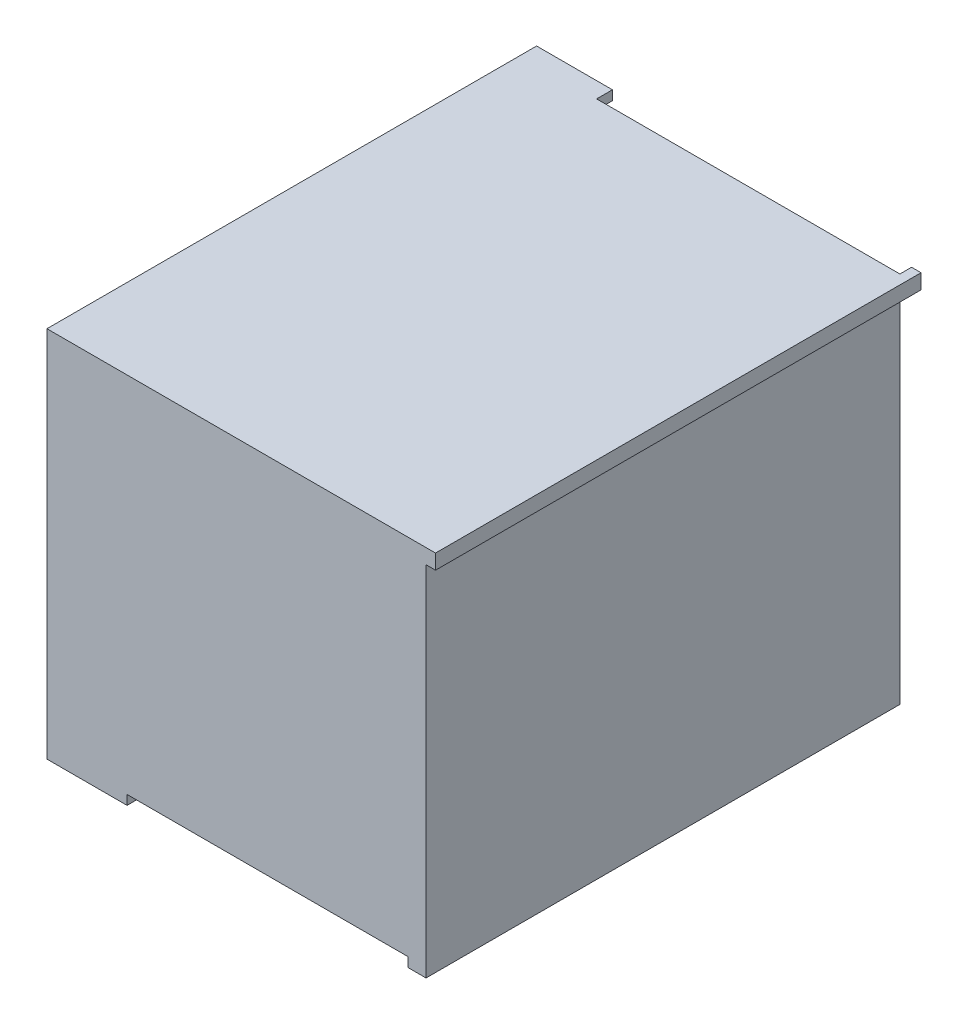
ISO-10303-21;
HEADER;
FILE_DESCRIPTION(('STEP AP214'),'2;1');
FILE_NAME('part.step','',(''),(''),'','','');
FILE_SCHEMA(('AUTOMOTIVE_DESIGN { 1 0 10303 214 1 1 1 1 }'));
ENDSEC;
DATA;
#1=APPLICATION_CONTEXT('core data for automotive mechanical design processes');
#2=APPLICATION_PROTOCOL_DEFINITION('international standard','automotive_design',2000,#1);
#3=PRODUCT_CONTEXT('',#1,'mechanical');
#4=PRODUCT('Part','Part','',(#3));
#5=PRODUCT_RELATED_PRODUCT_CATEGORY('part','',(#4));
#6=PRODUCT_DEFINITION_FORMATION('','',#4);
#7=PRODUCT_DEFINITION_CONTEXT('part definition',#1,'design');
#8=PRODUCT_DEFINITION('design','',#6,#7);
#9=PRODUCT_DEFINITION_SHAPE('','',#8);
#10=(LENGTH_UNIT() NAMED_UNIT(*) SI_UNIT(.MILLI.,.METRE.));
#11=(NAMED_UNIT(*) PLANE_ANGLE_UNIT() SI_UNIT($,.RADIAN.));
#12=(NAMED_UNIT(*) SI_UNIT($,.STERADIAN.) SOLID_ANGLE_UNIT());
#13=UNCERTAINTY_MEASURE_WITH_UNIT(LENGTH_MEASURE(1.E-05),#10,'distance_accuracy_value','');
#14=(GEOMETRIC_REPRESENTATION_CONTEXT(3) GLOBAL_UNCERTAINTY_ASSIGNED_CONTEXT((#13)) GLOBAL_UNIT_ASSIGNED_CONTEXT((#10,
#11,#12)) REPRESENTATION_CONTEXT('',''));
#15=CARTESIAN_POINT('',(0.,0.,0.));
#16=DIRECTION('',(0.,0.,1.));
#17=DIRECTION('',(1.,0.,0.));
#18=AXIS2_PLACEMENT_3D('',#15,#16,#17);
#19=CARTESIAN_POINT('',(57.8034682080927,419.075144508671,1500.));
#20=DIRECTION('',(-1.,0.,0.));
#21=DIRECTION('',(0.,-1.,0.));
#22=AXIS2_PLACEMENT_3D('',#19,#20,#21);
#23=PLANE('',#22);
#24=DIRECTION('',(0.,0.,-1.));
#25=VECTOR('',#24,1.);
#26=CARTESIAN_POINT('',(57.8034682080927,371.99332535689,1500.));
#27=LINE('',#26,#25);
#28=CARTESIAN_POINT('',(57.8034682080927,371.99332535689,1500.));
#29=VERTEX_POINT('',#28);
#30=CARTESIAN_POINT('',(57.8034682080927,371.99332535689,0.));
#31=VERTEX_POINT('',#30);
#32=EDGE_CURVE('E49',#29,#31,#27,.T.);
#33=ORIENTED_EDGE('',*,*,#32,.F.);
#34=DIRECTION('',(0.,1.,0.));
#35=VECTOR('',#34,1.);
#36=CARTESIAN_POINT('',(57.8034682080927,419.075144508671,1500.));
#37=LINE('',#36,#35);
#38=CARTESIAN_POINT('',(57.8034682080928,-760.924855491329,1500.));
#39=VERTEX_POINT('',#38);
#40=EDGE_CURVE('E236',#39,#29,#37,.T.);
#41=ORIENTED_EDGE('',*,*,#40,.F.);
#42=DIRECTION('',(0.,0.,1.));
#43=VECTOR('',#42,1.);
#44=CARTESIAN_POINT('',(57.8034682080928,-760.924855491329,0.));
#45=LINE('',#44,#43);
#46=CARTESIAN_POINT('',(57.8034682080928,-760.924855491329,0.));
#47=VERTEX_POINT('',#46);
#48=EDGE_CURVE('E213',#47,#39,#45,.T.);
#49=ORIENTED_EDGE('',*,*,#48,.F.);
#50=DIRECTION('',(0.,1.,0.));
#51=VECTOR('',#50,1.);
#52=CARTESIAN_POINT('',(57.8034682080927,419.075144508671,0.));
#53=LINE('',#52,#51);
#54=EDGE_CURVE('E245',#47,#31,#53,.T.);
#55=ORIENTED_EDGE('',*,*,#54,.T.);
#56=EDGE_LOOP('',(#33,#41,#49,#55));
#57=FACE_BOUND('',#56,.T.);
#58=ADVANCED_FACE('F34',(#57),#23,.F.);
#59=CARTESIAN_POINT('',(-1142.19653179191,-730.924855491329,1500.));
#60=DIRECTION('',(0.,1.,0.));
#61=DIRECTION('',(0.,0.,1.));
#62=AXIS2_PLACEMENT_3D('',#59,#60,#61);
#63=PLANE('',#62);
#64=DIRECTION('',(0.,0.,1.));
#65=VECTOR('',#64,1.);
#66=CARTESIAN_POINT('',(-888.610891226834,-730.924855491329,1500.));
#67=LINE('',#66,#65);
#68=CARTESIAN_POINT('',(-888.610891226834,-730.924855491329,0.));
#69=VERTEX_POINT('',#68);
#70=CARTESIAN_POINT('',(-888.610891226834,-730.924855491329,1500.));
#71=VERTEX_POINT('',#70);
#72=EDGE_CURVE('E194',#69,#71,#67,.T.);
#73=ORIENTED_EDGE('',*,*,#72,.F.);
#74=DIRECTION('',(1.,0.,0.));
#75=VECTOR('',#74,1.);
#76=CARTESIAN_POINT('',(-1142.19653179191,-730.924855491329,0.));
#77=LINE('',#76,#75);
#78=CARTESIAN_POINT('',(0.,-730.924855491329,0.));
#79=VERTEX_POINT('',#78);
#80=EDGE_CURVE('E242',#69,#79,#77,.T.);
#81=ORIENTED_EDGE('',*,*,#80,.T.);
#82=DIRECTION('',(0.,0.,-1.));
#83=VECTOR('',#82,1.);
#84=CARTESIAN_POINT('',(0.,-730.924855491329,0.));
#85=LINE('',#84,#83);
#86=CARTESIAN_POINT('',(0.,-730.924855491329,1500.));
#87=VERTEX_POINT('',#86);
#88=EDGE_CURVE('E212',#87,#79,#85,.T.);
#89=ORIENTED_EDGE('',*,*,#88,.F.);
#90=DIRECTION('',(1.,0.,0.));
#91=VECTOR('',#90,1.);
#92=CARTESIAN_POINT('',(-1142.19653179191,-730.924855491329,1500.));
#93=LINE('',#92,#91);
#94=EDGE_CURVE('E57',#71,#87,#93,.T.);
#95=ORIENTED_EDGE('',*,*,#94,.F.);
#96=EDGE_LOOP('',(#73,#81,#89,#95));
#97=FACE_BOUND('',#96,.T.);
#98=ADVANCED_FACE('F284',(#97),#63,.F.);
#99=CARTESIAN_POINT('',(-1142.19653179191,419.075144508671,1500.));
#100=DIRECTION('',(1.,0.,0.));
#101=DIRECTION('',(0.,1.,0.));
#102=AXIS2_PLACEMENT_3D('',#99,#100,#101);
#103=PLANE('',#102);
#104=DIRECTION('',(0.,0.,-1.));
#105=VECTOR('',#104,1.);
#106=CARTESIAN_POINT('',(-1142.19653179191,-760.924855491329,1500.));
#107=LINE('',#106,#105);
#108=CARTESIAN_POINT('',(-1142.19653179191,-760.924855491329,1500.));
#109=VERTEX_POINT('',#108);
#110=CARTESIAN_POINT('',(-1142.19653179191,-760.924855491329,0.));
#111=VERTEX_POINT('',#110);
#112=EDGE_CURVE('E195',#109,#111,#107,.T.);
#113=ORIENTED_EDGE('',*,*,#112,.F.);
#114=DIRECTION('',(0.,-1.,0.));
#115=VECTOR('',#114,1.);
#116=CARTESIAN_POINT('',(-1142.19653179191,419.075144508671,1500.));
#117=LINE('',#116,#115);
#118=CARTESIAN_POINT('',(-1142.19653179191,419.075144508671,1500.));
#119=VERTEX_POINT('',#118);
#120=EDGE_CURVE('E232',#119,#109,#117,.T.);
#121=ORIENTED_EDGE('',*,*,#120,.F.);
#122=DIRECTION('',(0.,0.,-1.));
#123=VECTOR('',#122,1.);
#124=CARTESIAN_POINT('',(-1142.19653179191,419.075144508671,1500.));
#125=LINE('',#124,#123);
#126=CARTESIAN_POINT('',(-1142.19653179191,419.075144508671,-50.));
#127=VERTEX_POINT('',#126);
#128=EDGE_CURVE('E240',#119,#127,#125,.T.);
#129=ORIENTED_EDGE('',*,*,#128,.T.);
#130=DIRECTION('',(0.,1.,0.));
#131=VECTOR('',#130,1.);
#132=CARTESIAN_POINT('',(-1142.19653179191,389.075144508671,-50.));
#133=LINE('',#132,#131);
#134=CARTESIAN_POINT('',(-1142.19653179191,389.075144508671,-50.));
#135=VERTEX_POINT('',#134);
#136=EDGE_CURVE('E156',#135,#127,#133,.T.);
#137=ORIENTED_EDGE('',*,*,#136,.F.);
#138=DIRECTION('',(0.,0.,1.));
#139=VECTOR('',#138,1.);
#140=CARTESIAN_POINT('',(-1142.19653179191,389.075144508671,1500.));
#141=LINE('',#140,#139);
#142=CARTESIAN_POINT('',(-1142.19653179191,389.075144508671,0.));
#143=VERTEX_POINT('',#142);
#144=EDGE_CURVE('E148',#135,#143,#141,.T.);
#145=ORIENTED_EDGE('',*,*,#144,.T.);
#146=DIRECTION('',(0.,-1.,0.));
#147=VECTOR('',#146,1.);
#148=CARTESIAN_POINT('',(-1142.19653179191,419.075144508671,0.));
#149=LINE('',#148,#147);
#150=EDGE_CURVE('E231',#143,#111,#149,.T.);
#151=ORIENTED_EDGE('',*,*,#150,.T.);
#152=EDGE_LOOP('',(#113,#121,#129,#137,#145,#151));
#153=FACE_BOUND('',#152,.T.);
#154=ADVANCED_FACE('F36',(#153),#103,.F.);
#155=CARTESIAN_POINT('',(-1142.19653179191,419.075144508671,1500.));
#156=DIRECTION('',(0.,-1.,0.));
#157=DIRECTION('',(0.,0.,-1.));
#158=AXIS2_PLACEMENT_3D('',#155,#156,#157);
#159=PLANE('',#158);
#160=DIRECTION('',(-1.,0.,0.));
#161=VECTOR('',#160,1.);
#162=CARTESIAN_POINT('',(-1142.19653179191,419.075144508671,0.));
#163=LINE('',#162,#161);
#164=CARTESIAN_POINT('',(57.8034682080927,419.075144508671,0.));
#165=VERTEX_POINT('',#164);
#166=CARTESIAN_POINT('',(-902.203187456337,419.075144508671,0.));
#167=VERTEX_POINT('',#166);
#168=EDGE_CURVE('E234',#165,#167,#163,.T.);
#169=ORIENTED_EDGE('',*,*,#168,.T.);
#170=DIRECTION('',(0.,0.,-1.));
#171=VECTOR('',#170,1.);
#172=CARTESIAN_POINT('',(-902.203187456337,419.075144508671,1500.));
#173=LINE('',#172,#171);
#174=CARTESIAN_POINT('',(-902.203187456337,419.075144508671,-50.));
#175=VERTEX_POINT('',#174);
#176=EDGE_CURVE('E164',#167,#175,#173,.T.);
#177=ORIENTED_EDGE('',*,*,#176,.T.);
#178=DIRECTION('',(-1.,0.,0.));
#179=VECTOR('',#178,1.);
#180=CARTESIAN_POINT('',(-1142.19653179191,419.075144508671,-50.));
#181=LINE('',#180,#179);
#182=EDGE_CURVE('E155',#175,#127,#181,.T.);
#183=ORIENTED_EDGE('',*,*,#182,.T.);
#184=ORIENTED_EDGE('',*,*,#128,.F.);
#185=DIRECTION('',(-1.,0.,0.));
#186=VECTOR('',#185,1.);
#187=CARTESIAN_POINT('',(-1142.19653179191,419.075144508671,1500.));
#188=LINE('',#187,#186);
#189=CARTESIAN_POINT('',(87.8034682080927,419.075144508671,1500.));
#190=VERTEX_POINT('',#189);
#191=EDGE_CURVE('E238',#190,#119,#188,.T.);
#192=ORIENTED_EDGE('',*,*,#191,.F.);
#193=DIRECTION('',(0.,0.,1.));
#194=VECTOR('',#193,1.);
#195=CARTESIAN_POINT('',(87.8034682080927,419.075144508671,1500.));
#196=LINE('',#195,#194);
#197=CARTESIAN_POINT('',(87.8034682080927,419.075144508671,-36.9464874790424));
#198=VERTEX_POINT('',#197);
#199=EDGE_CURVE('E177',#198,#190,#196,.T.);
#200=ORIENTED_EDGE('',*,*,#199,.F.);
#201=DIRECTION('',(-1.,0.,0.));
#202=VECTOR('',#201,1.);
#203=CARTESIAN_POINT('',(87.8034682080927,419.075144508671,-36.9464874790424));
#204=LINE('',#203,#202);
#205=CARTESIAN_POINT('',(57.8034682080927,419.075144508671,-36.9464874790424));
#206=VERTEX_POINT('',#205);
#207=EDGE_CURVE('E180',#198,#206,#204,.T.);
#208=ORIENTED_EDGE('',*,*,#207,.T.);
#209=DIRECTION('',(0.,0.,1.));
#210=VECTOR('',#209,1.);
#211=CARTESIAN_POINT('',(57.8034682080927,419.075144508671,1500.));
#212=LINE('',#211,#210);
#213=EDGE_CURVE('E173',#206,#165,#212,.T.);
#214=ORIENTED_EDGE('',*,*,#213,.T.);
#215=EDGE_LOOP('',(#169,#177,#183,#184,#192,#200,#208,#214));
#216=FACE_BOUND('',#215,.T.);
#217=ADVANCED_FACE('F258',(#216),#159,.F.);
#218=CARTESIAN_POINT('',(0.,0.,1500.));
#219=DIRECTION('',(0.,0.,1.));
#220=DIRECTION('',(1.,0.,0.));
#221=AXIS2_PLACEMENT_3D('',#218,#219,#220);
#222=PLANE('',#221);
#223=ORIENTED_EDGE('',*,*,#191,.T.);
#224=ORIENTED_EDGE('',*,*,#120,.T.);
#225=DIRECTION('',(-1.,0.,0.));
#226=VECTOR('',#225,1.);
#227=CARTESIAN_POINT('',(-1142.19653179191,-760.924855491329,1500.));
#228=LINE('',#227,#226);
#229=CARTESIAN_POINT('',(-888.610891226834,-760.924855491329,1500.));
#230=VERTEX_POINT('',#229);
#231=EDGE_CURVE('E202',#230,#109,#228,.T.);
#232=ORIENTED_EDGE('',*,*,#231,.F.);
#233=DIRECTION('',(0.,1.,0.));
#234=VECTOR('',#233,1.);
#235=CARTESIAN_POINT('',(-888.610891226834,-760.924855491329,1500.));
#236=LINE('',#235,#234);
#237=EDGE_CURVE('E205',#230,#71,#236,.T.);
#238=ORIENTED_EDGE('',*,*,#237,.T.);
#239=ORIENTED_EDGE('',*,*,#94,.T.);
#240=DIRECTION('',(0.,1.,0.));
#241=VECTOR('',#240,1.);
#242=CARTESIAN_POINT('',(0.,-760.924855491329,1500.));
#243=LINE('',#242,#241);
#244=CARTESIAN_POINT('',(0.,-760.924855491329,1500.));
#245=VERTEX_POINT('',#244);
#246=EDGE_CURVE('E228',#245,#87,#243,.T.);
#247=ORIENTED_EDGE('',*,*,#246,.F.);
#248=DIRECTION('',(-1.,0.,0.));
#249=VECTOR('',#248,1.);
#250=CARTESIAN_POINT('',(57.8034682080928,-760.924855491329,1500.));
#251=LINE('',#250,#249);
#252=EDGE_CURVE('E216',#39,#245,#251,.T.);
#253=ORIENTED_EDGE('',*,*,#252,.F.);
#254=ORIENTED_EDGE('',*,*,#40,.T.);
#255=DIRECTION('',(-1.,0.,0.));
#256=VECTOR('',#255,1.);
#257=CARTESIAN_POINT('',(87.8034682080927,371.99332535689,1500.));
#258=LINE('',#257,#256);
#259=CARTESIAN_POINT('',(87.8034682080927,371.99332535689,1500.));
#260=VERTEX_POINT('',#259);
#261=EDGE_CURVE('E191',#260,#29,#258,.T.);
#262=ORIENTED_EDGE('',*,*,#261,.F.);
#263=DIRECTION('',(0.,-1.,0.));
#264=VECTOR('',#263,1.);
#265=CARTESIAN_POINT('',(87.8034682080927,419.075144508671,1500.));
#266=LINE('',#265,#264);
#267=EDGE_CURVE('E169',#190,#260,#266,.T.);
#268=ORIENTED_EDGE('',*,*,#267,.F.);
#269=EDGE_LOOP('',(#223,#224,#232,#238,#239,#247,#253,#254,#262,#268));
#270=FACE_BOUND('',#269,.T.);
#271=ADVANCED_FACE('F272',(#270),#222,.T.);
#272=CARTESIAN_POINT('',(0.,0.,0.));
#273=DIRECTION('',(0.,0.,1.));
#274=DIRECTION('',(1.,0.,0.));
#275=AXIS2_PLACEMENT_3D('',#272,#273,#274);
#276=PLANE('',#275);
#277=DIRECTION('',(1.,0.,0.));
#278=VECTOR('',#277,1.);
#279=CARTESIAN_POINT('',(0.,389.075144508671,0.));
#280=LINE('',#279,#278);
#281=CARTESIAN_POINT('',(-902.203187456337,389.075144508671,0.));
#282=VERTEX_POINT('',#281);
#283=EDGE_CURVE('E42',#143,#282,#280,.T.);
#284=ORIENTED_EDGE('',*,*,#283,.T.);
#285=DIRECTION('',(0.,1.,0.));
#286=VECTOR('',#285,1.);
#287=CARTESIAN_POINT('',(-902.203187456337,0.,0.));
#288=LINE('',#287,#286);
#289=EDGE_CURVE('E11',#282,#167,#288,.T.);
#290=ORIENTED_EDGE('',*,*,#289,.T.);
#291=ORIENTED_EDGE('',*,*,#168,.F.);
#292=EDGE_CURVE('E244',#31,#165,#53,.T.);
#293=ORIENTED_EDGE('',*,*,#292,.F.);
#294=ORIENTED_EDGE('',*,*,#54,.F.);
#295=DIRECTION('',(1.,0.,0.));
#296=VECTOR('',#295,1.);
#297=CARTESIAN_POINT('',(57.8034682080928,-760.924855491329,0.));
#298=LINE('',#297,#296);
#299=CARTESIAN_POINT('',(0.,-760.924855491329,0.));
#300=VERTEX_POINT('',#299);
#301=EDGE_CURVE('E220',#300,#47,#298,.T.);
#302=ORIENTED_EDGE('',*,*,#301,.F.);
#303=DIRECTION('',(0.,1.,0.));
#304=VECTOR('',#303,1.);
#305=CARTESIAN_POINT('',(0.,-760.924855491329,0.));
#306=LINE('',#305,#304);
#307=EDGE_CURVE('E223',#300,#79,#306,.T.);
#308=ORIENTED_EDGE('',*,*,#307,.T.);
#309=ORIENTED_EDGE('',*,*,#80,.F.);
#310=DIRECTION('',(0.,1.,0.));
#311=VECTOR('',#310,1.);
#312=CARTESIAN_POINT('',(-888.610891226834,-760.924855491329,0.));
#313=LINE('',#312,#311);
#314=CARTESIAN_POINT('',(-888.610891226834,-760.924855491329,0.));
#315=VERTEX_POINT('',#314);
#316=EDGE_CURVE('E209',#315,#69,#313,.T.);
#317=ORIENTED_EDGE('',*,*,#316,.F.);
#318=DIRECTION('',(1.,0.,0.));
#319=VECTOR('',#318,1.);
#320=CARTESIAN_POINT('',(-1142.19653179191,-760.924855491329,0.));
#321=LINE('',#320,#319);
#322=EDGE_CURVE('E198',#111,#315,#321,.T.);
#323=ORIENTED_EDGE('',*,*,#322,.F.);
#324=ORIENTED_EDGE('',*,*,#150,.F.);
#325=EDGE_LOOP('',(#284,#290,#291,#293,#294,#302,#308,#309,#317,#323,#324));
#326=FACE_BOUND('',#325,.T.);
#327=ADVANCED_FACE('F251',(#326),#276,.F.);
#328=CARTESIAN_POINT('',(0.,-760.924855491329,0.));
#329=DIRECTION('',(1.,0.,0.));
#330=DIRECTION('',(0.,0.,-1.));
#331=AXIS2_PLACEMENT_3D('',#328,#329,#330);
#332=PLANE('',#331);
#333=ORIENTED_EDGE('',*,*,#88,.T.);
#334=ORIENTED_EDGE('',*,*,#307,.F.);
#335=DIRECTION('',(0.,0.,-1.));
#336=VECTOR('',#335,1.);
#337=CARTESIAN_POINT('',(0.,-760.924855491329,0.));
#338=LINE('',#337,#336);
#339=EDGE_CURVE('E218',#245,#300,#338,.T.);
#340=ORIENTED_EDGE('',*,*,#339,.F.);
#341=ORIENTED_EDGE('',*,*,#246,.T.);
#342=EDGE_LOOP('',(#333,#334,#340,#341));
#343=FACE_BOUND('',#342,.T.);
#344=ADVANCED_FACE('F283',(#343),#332,.F.);
#345=CARTESIAN_POINT('',(0.,-760.924855491329,0.));
#346=DIRECTION('',(0.,-1.,0.));
#347=DIRECTION('',(0.,0.,-1.));
#348=AXIS2_PLACEMENT_3D('',#345,#346,#347);
#349=PLANE('',#348);
#350=ORIENTED_EDGE('',*,*,#48,.T.);
#351=ORIENTED_EDGE('',*,*,#252,.T.);
#352=ORIENTED_EDGE('',*,*,#339,.T.);
#353=ORIENTED_EDGE('',*,*,#301,.T.);
#354=EDGE_LOOP('',(#350,#351,#352,#353));
#355=FACE_BOUND('',#354,.T.);
#356=ADVANCED_FACE('F277',(#355),#349,.T.);
#357=CARTESIAN_POINT('',(-888.610891226834,-760.924855491329,1500.));
#358=DIRECTION('',(-1.,0.,0.));
#359=DIRECTION('',(0.,0.,1.));
#360=AXIS2_PLACEMENT_3D('',#357,#358,#359);
#361=PLANE('',#360);
#362=ORIENTED_EDGE('',*,*,#72,.T.);
#363=ORIENTED_EDGE('',*,*,#237,.F.);
#364=DIRECTION('',(0.,0.,1.));
#365=VECTOR('',#364,1.);
#366=CARTESIAN_POINT('',(-888.610891226834,-760.924855491329,1500.));
#367=LINE('',#366,#365);
#368=EDGE_CURVE('E200',#315,#230,#367,.T.);
#369=ORIENTED_EDGE('',*,*,#368,.F.);
#370=ORIENTED_EDGE('',*,*,#316,.T.);
#371=EDGE_LOOP('',(#362,#363,#369,#370));
#372=FACE_BOUND('',#371,.T.);
#373=ADVANCED_FACE('F288',(#372),#361,.F.);
#374=CARTESIAN_POINT('',(0.,-760.924855491329,0.));
#375=DIRECTION('',(0.,-1.,0.));
#376=DIRECTION('',(0.,0.,-1.));
#377=AXIS2_PLACEMENT_3D('',#374,#375,#376);
#378=PLANE('',#377);
#379=ORIENTED_EDGE('',*,*,#112,.T.);
#380=ORIENTED_EDGE('',*,*,#322,.T.);
#381=ORIENTED_EDGE('',*,*,#368,.T.);
#382=ORIENTED_EDGE('',*,*,#231,.T.);
#383=EDGE_LOOP('',(#379,#380,#381,#382));
#384=FACE_BOUND('',#383,.T.);
#385=ADVANCED_FACE('F290',(#384),#378,.T.);
#386=CARTESIAN_POINT('',(57.8034682080927,0.,0.));
#387=DIRECTION('',(1.,0.,0.));
#388=DIRECTION('',(0.,1.,0.));
#389=AXIS2_PLACEMENT_3D('',#386,#387,#388);
#390=PLANE('',#389);
#391=CARTESIAN_POINT('',(57.8034682080927,371.99332535689,-36.9464874790424));
#392=VERTEX_POINT('',#391);
#393=EDGE_CURVE('E167',#31,#392,#27,.T.);
#394=ORIENTED_EDGE('',*,*,#393,.F.);
#395=ORIENTED_EDGE('',*,*,#292,.T.);
#396=ORIENTED_EDGE('',*,*,#213,.F.);
#397=DIRECTION('',(0.,1.,0.));
#398=VECTOR('',#397,1.);
#399=CARTESIAN_POINT('',(57.8034682080927,419.075144508671,-36.9464874790424));
#400=LINE('',#399,#398);
#401=EDGE_CURVE('E182',#392,#206,#400,.T.);
#402=ORIENTED_EDGE('',*,*,#401,.F.);
#403=EDGE_LOOP('',(#394,#395,#396,#402));
#404=FACE_BOUND('',#403,.T.);
#405=ADVANCED_FACE('F264',(#404),#390,.F.);
#406=CARTESIAN_POINT('',(87.8034682080927,371.99332535689,1500.));
#407=DIRECTION('',(0.,1.,0.));
#408=DIRECTION('',(-1.,0.,0.));
#409=AXIS2_PLACEMENT_3D('',#406,#407,#408);
#410=PLANE('',#409);
#411=ORIENTED_EDGE('',*,*,#32,.T.);
#412=ORIENTED_EDGE('',*,*,#393,.T.);
#413=DIRECTION('',(-1.,0.,0.));
#414=VECTOR('',#413,1.);
#415=CARTESIAN_POINT('',(87.8034682080927,371.99332535689,-36.9464874790424));
#416=LINE('',#415,#414);
#417=CARTESIAN_POINT('',(87.8034682080927,371.99332535689,-36.9464874790424));
#418=VERTEX_POINT('',#417);
#419=EDGE_CURVE('E188',#418,#392,#416,.T.);
#420=ORIENTED_EDGE('',*,*,#419,.F.);
#421=DIRECTION('',(0.,0.,-1.));
#422=VECTOR('',#421,1.);
#423=CARTESIAN_POINT('',(87.8034682080927,371.99332535689,1500.));
#424=LINE('',#423,#422);
#425=EDGE_CURVE('E172',#260,#418,#424,.T.);
#426=ORIENTED_EDGE('',*,*,#425,.F.);
#427=ORIENTED_EDGE('',*,*,#261,.T.);
#428=EDGE_LOOP('',(#411,#412,#420,#426,#427));
#429=FACE_BOUND('',#428,.T.);
#430=ADVANCED_FACE('F268',(#429),#410,.F.);
#431=CARTESIAN_POINT('',(87.8034682080927,419.075144508671,-36.9464874790424));
#432=DIRECTION('',(0.,0.,1.));
#433=DIRECTION('',(1.,0.,0.));
#434=AXIS2_PLACEMENT_3D('',#431,#432,#433);
#435=PLANE('',#434);
#436=ORIENTED_EDGE('',*,*,#401,.T.);
#437=ORIENTED_EDGE('',*,*,#207,.F.);
#438=DIRECTION('',(0.,1.,0.));
#439=VECTOR('',#438,1.);
#440=CARTESIAN_POINT('',(87.8034682080927,419.075144508671,-36.9464874790424));
#441=LINE('',#440,#439);
#442=EDGE_CURVE('E175',#418,#198,#441,.T.);
#443=ORIENTED_EDGE('',*,*,#442,.F.);
#444=ORIENTED_EDGE('',*,*,#419,.T.);
#445=EDGE_LOOP('',(#436,#437,#443,#444));
#446=FACE_BOUND('',#445,.T.);
#447=ADVANCED_FACE('F298',(#446),#435,.F.);
#448=CARTESIAN_POINT('',(87.8034682080927,0.,0.));
#449=DIRECTION('',(1.,0.,0.));
#450=DIRECTION('',(0.,1.,0.));
#451=AXIS2_PLACEMENT_3D('',#448,#449,#450);
#452=PLANE('',#451);
#453=ORIENTED_EDGE('',*,*,#267,.T.);
#454=ORIENTED_EDGE('',*,*,#425,.T.);
#455=ORIENTED_EDGE('',*,*,#442,.T.);
#456=ORIENTED_EDGE('',*,*,#199,.T.);
#457=EDGE_LOOP('',(#453,#454,#455,#456));
#458=FACE_BOUND('',#457,.T.);
#459=ADVANCED_FACE('F294',(#458),#452,.T.);
#460=CARTESIAN_POINT('',(-902.203187456337,389.075144508671,1500.));
#461=DIRECTION('',(1.,0.,0.));
#462=DIRECTION('',(0.,0.,-1.));
#463=AXIS2_PLACEMENT_3D('',#460,#461,#462);
#464=PLANE('',#463);
#465=ORIENTED_EDGE('',*,*,#289,.F.);
#466=DIRECTION('',(0.,0.,-1.));
#467=VECTOR('',#466,1.);
#468=CARTESIAN_POINT('',(-902.203187456337,389.075144508671,1500.));
#469=LINE('',#468,#467);
#470=CARTESIAN_POINT('',(-902.203187456337,389.075144508671,-50.));
#471=VERTEX_POINT('',#470);
#472=EDGE_CURVE('E139',#282,#471,#469,.T.);
#473=ORIENTED_EDGE('',*,*,#472,.T.);
#474=DIRECTION('',(0.,1.,0.));
#475=VECTOR('',#474,1.);
#476=CARTESIAN_POINT('',(-902.203187456337,389.075144508671,-50.));
#477=LINE('',#476,#475);
#478=EDGE_CURVE('E142',#471,#175,#477,.T.);
#479=ORIENTED_EDGE('',*,*,#478,.T.);
#480=ORIENTED_EDGE('',*,*,#176,.F.);
#481=EDGE_LOOP('',(#465,#473,#479,#480));
#482=FACE_BOUND('',#481,.T.);
#483=ADVANCED_FACE('F141',(#482),#464,.T.);
#484=CARTESIAN_POINT('',(0.,389.075144508671,0.));
#485=DIRECTION('',(0.,-1.,0.));
#486=DIRECTION('',(0.,0.,-1.));
#487=AXIS2_PLACEMENT_3D('',#484,#485,#486);
#488=PLANE('',#487);
#489=ORIENTED_EDGE('',*,*,#283,.F.);
#490=ORIENTED_EDGE('',*,*,#144,.F.);
#491=DIRECTION('',(-1.,0.,0.));
#492=VECTOR('',#491,1.);
#493=CARTESIAN_POINT('',(-1142.19653179191,389.075144508671,-50.));
#494=LINE('',#493,#492);
#495=EDGE_CURVE('E147',#471,#135,#494,.T.);
#496=ORIENTED_EDGE('',*,*,#495,.F.);
#497=ORIENTED_EDGE('',*,*,#472,.F.);
#498=EDGE_LOOP('',(#489,#490,#496,#497));
#499=FACE_BOUND('',#498,.T.);
#500=ADVANCED_FACE('F159',(#499),#488,.T.);
#501=CARTESIAN_POINT('',(-1142.19653179191,389.075144508671,-50.));
#502=DIRECTION('',(0.,0.,-1.));
#503=DIRECTION('',(-1.,0.,0.));
#504=AXIS2_PLACEMENT_3D('',#501,#502,#503);
#505=PLANE('',#504);
#506=ORIENTED_EDGE('',*,*,#182,.F.);
#507=ORIENTED_EDGE('',*,*,#478,.F.);
#508=ORIENTED_EDGE('',*,*,#495,.T.);
#509=ORIENTED_EDGE('',*,*,#136,.T.);
#510=EDGE_LOOP('',(#506,#507,#508,#509));
#511=FACE_BOUND('',#510,.T.);
#512=ADVANCED_FACE('F152',(#511),#505,.T.);
#513=CLOSED_SHELL('',(#58,#98,#154,#217,#271,#327,#344,#356,#373,#385,#405,#430,#447,#459,#483,
#500,#512));
#514=MANIFOLD_SOLID_BREP('B2',#513);
#515=ADVANCED_BREP_SHAPE_REPRESENTATION('',(#18,#514),#14);
#516=SHAPE_DEFINITION_REPRESENTATION(#9,#515);
ENDSEC;
END-ISO-10303-21;
